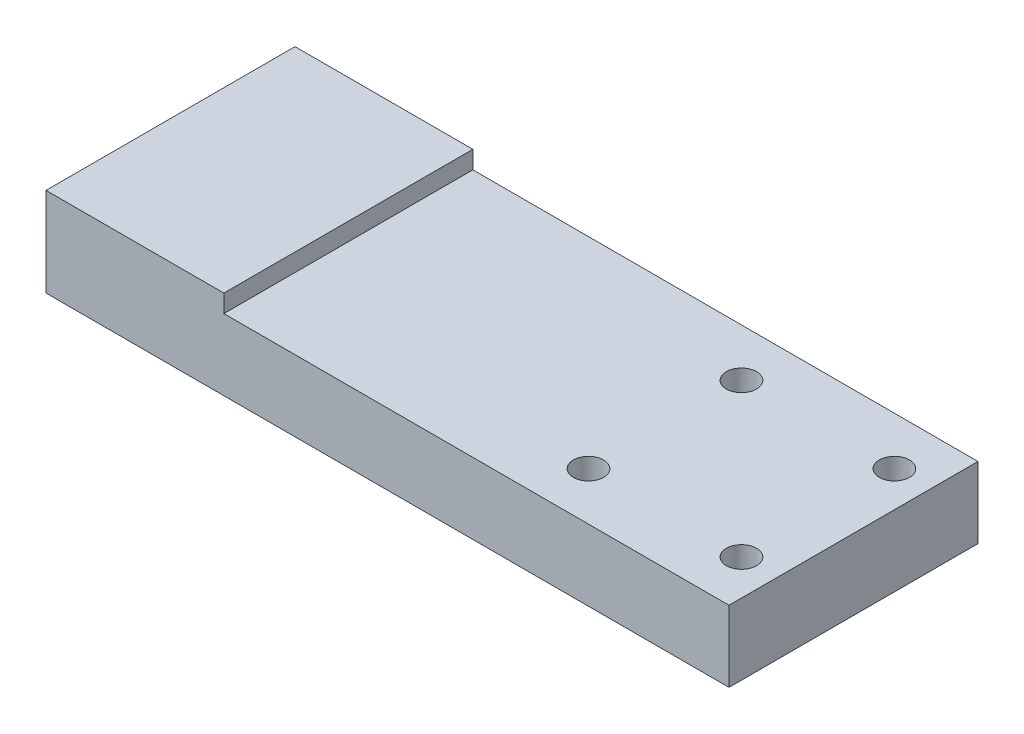
ISO-10303-21;
HEADER;
FILE_DESCRIPTION(('STEP AP214'),'2;1');
FILE_NAME('part.step','',(''),(''),'','','');
FILE_SCHEMA(('AUTOMOTIVE_DESIGN { 1 0 10303 214 1 1 1 1 }'));
ENDSEC;
DATA;
#1=APPLICATION_CONTEXT('core data for automotive mechanical design processes');
#2=APPLICATION_PROTOCOL_DEFINITION('international standard','automotive_design',2000,#1);
#3=PRODUCT_CONTEXT('',#1,'mechanical');
#4=PRODUCT('Part','Part','',(#3));
#5=PRODUCT_RELATED_PRODUCT_CATEGORY('part','',(#4));
#6=PRODUCT_DEFINITION_FORMATION('','',#4);
#7=PRODUCT_DEFINITION_CONTEXT('part definition',#1,'design');
#8=PRODUCT_DEFINITION('design','',#6,#7);
#9=PRODUCT_DEFINITION_SHAPE('','',#8);
#10=(LENGTH_UNIT() NAMED_UNIT(*) SI_UNIT(.MILLI.,.METRE.));
#11=(NAMED_UNIT(*) PLANE_ANGLE_UNIT() SI_UNIT($,.RADIAN.));
#12=(NAMED_UNIT(*) SI_UNIT($,.STERADIAN.) SOLID_ANGLE_UNIT());
#13=UNCERTAINTY_MEASURE_WITH_UNIT(LENGTH_MEASURE(1.E-05),#10,'distance_accuracy_value','');
#14=(GEOMETRIC_REPRESENTATION_CONTEXT(3) GLOBAL_UNCERTAINTY_ASSIGNED_CONTEXT((#13)) GLOBAL_UNIT_ASSIGNED_CONTEXT((#10,
#11,#12)) REPRESENTATION_CONTEXT('',''));
#15=CARTESIAN_POINT('',(0.,0.,0.));
#16=DIRECTION('',(0.,0.,1.));
#17=DIRECTION('',(1.,0.,0.));
#18=AXIS2_PLACEMENT_3D('',#15,#16,#17);
#19=CARTESIAN_POINT('',(43.,25.001,-21.5));
#20=DIRECTION('',(0.,-1.,0.));
#21=DIRECTION('',(0.,0.,-1.));
#22=AXIS2_PLACEMENT_3D('',#19,#20,#21);
#23=CYLINDRICAL_SURFACE('',#22,4.25);
#24=CARTESIAN_POINT('',(43.,0.,-21.5));
#25=DIRECTION('',(0.,-1.,0.));
#26=DIRECTION('',(0.,0.,-1.));
#27=AXIS2_PLACEMENT_3D('',#24,#25,#26);
#28=CIRCLE('',#27,4.25);
#29=CARTESIAN_POINT('',(43.,0.,-25.75));
#30=VERTEX_POINT('',#29);
#31=EDGE_CURVE('E11',#30,#30,#28,.T.);
#32=ORIENTED_EDGE('',*,*,#31,.T.);
#33=EDGE_LOOP('',(#32));
#34=FACE_BOUND('',#33,.T.);
#35=CARTESIAN_POINT('',(43.,20.,-21.5));
#36=DIRECTION('',(0.,1.,0.));
#37=DIRECTION('',(0.,0.,1.));
#38=AXIS2_PLACEMENT_3D('',#35,#36,#37);
#39=CIRCLE('',#38,4.25);
#40=CARTESIAN_POINT('',(43.,20.,-17.25));
#41=VERTEX_POINT('',#40);
#42=EDGE_CURVE('E135',#41,#41,#39,.F.);
#43=ORIENTED_EDGE('',*,*,#42,.F.);
#44=EDGE_LOOP('',(#43));
#45=FACE_BOUND('',#44,.T.);
#46=ADVANCED_FACE('F35',(#34,#45),#23,.F.);
#47=CARTESIAN_POINT('',(86.,25.001,-21.5));
#48=DIRECTION('',(0.,-1.,0.));
#49=DIRECTION('',(0.,0.,-1.));
#50=AXIS2_PLACEMENT_3D('',#47,#48,#49);
#51=CYLINDRICAL_SURFACE('',#50,4.25);
#52=CARTESIAN_POINT('',(86.,0.,-21.5));
#53=DIRECTION('',(0.,-1.,0.));
#54=DIRECTION('',(0.,0.,-1.));
#55=AXIS2_PLACEMENT_3D('',#52,#53,#54);
#56=CIRCLE('',#55,4.25);
#57=CARTESIAN_POINT('',(86.,0.,-25.75));
#58=VERTEX_POINT('',#57);
#59=EDGE_CURVE('E43',#58,#58,#56,.T.);
#60=ORIENTED_EDGE('',*,*,#59,.T.);
#61=EDGE_LOOP('',(#60));
#62=FACE_BOUND('',#61,.T.);
#63=CARTESIAN_POINT('',(86.,20.,-21.5));
#64=DIRECTION('',(0.,1.,0.));
#65=DIRECTION('',(0.,0.,1.));
#66=AXIS2_PLACEMENT_3D('',#63,#64,#65);
#67=CIRCLE('',#66,4.25);
#68=CARTESIAN_POINT('',(86.,20.,-17.25));
#69=VERTEX_POINT('',#68);
#70=EDGE_CURVE('E137',#69,#69,#67,.F.);
#71=ORIENTED_EDGE('',*,*,#70,.F.);
#72=EDGE_LOOP('',(#71));
#73=FACE_BOUND('',#72,.T.);
#74=ADVANCED_FACE('F121',(#62,#73),#51,.F.);
#75=CARTESIAN_POINT('',(96.,25.,35.));
#76=DIRECTION('',(-1.,0.,0.));
#77=DIRECTION('',(0.,0.,1.));
#78=AXIS2_PLACEMENT_3D('',#75,#76,#77);
#79=PLANE('',#78);
#80=DIRECTION('',(0.,0.,-1.));
#81=VECTOR('',#80,1.);
#82=CARTESIAN_POINT('',(96.,20.,35.));
#83=LINE('',#82,#81);
#84=CARTESIAN_POINT('',(96.,20.,35.));
#85=VERTEX_POINT('',#84);
#86=CARTESIAN_POINT('',(96.,20.,-35.));
#87=VERTEX_POINT('',#86);
#88=EDGE_CURVE('E164',#85,#87,#83,.T.);
#89=ORIENTED_EDGE('',*,*,#88,.F.);
#90=DIRECTION('',(0.,-1.,0.));
#91=VECTOR('',#90,1.);
#92=CARTESIAN_POINT('',(96.,25.,35.));
#93=LINE('',#92,#91);
#94=CARTESIAN_POINT('',(96.,0.,35.));
#95=VERTEX_POINT('',#94);
#96=EDGE_CURVE('E114',#85,#95,#93,.T.);
#97=ORIENTED_EDGE('',*,*,#96,.T.);
#98=DIRECTION('',(0.,0.,-1.));
#99=VECTOR('',#98,1.);
#100=CARTESIAN_POINT('',(96.,0.,35.));
#101=LINE('',#100,#99);
#102=CARTESIAN_POINT('',(96.,0.,-35.));
#103=VERTEX_POINT('',#102);
#104=EDGE_CURVE('E90',#95,#103,#101,.T.);
#105=ORIENTED_EDGE('',*,*,#104,.T.);
#106=DIRECTION('',(0.,-1.,0.));
#107=VECTOR('',#106,1.);
#108=CARTESIAN_POINT('',(96.,25.,-35.));
#109=LINE('',#108,#107);
#110=EDGE_CURVE('E84',#87,#103,#109,.T.);
#111=ORIENTED_EDGE('',*,*,#110,.F.);
#112=EDGE_LOOP('',(#89,#97,#105,#111));
#113=FACE_BOUND('',#112,.T.);
#114=ADVANCED_FACE('F176',(#113),#79,.F.);
#115=CARTESIAN_POINT('',(86.,25.001,21.5));
#116=DIRECTION('',(0.,-1.,0.));
#117=DIRECTION('',(0.,0.,-1.));
#118=AXIS2_PLACEMENT_3D('',#115,#116,#117);
#119=CYLINDRICAL_SURFACE('',#118,4.25);
#120=CARTESIAN_POINT('',(86.,0.,21.5));
#121=DIRECTION('',(0.,-1.,0.));
#122=DIRECTION('',(0.,0.,-1.));
#123=AXIS2_PLACEMENT_3D('',#120,#121,#122);
#124=CIRCLE('',#123,4.25);
#125=CARTESIAN_POINT('',(86.,0.,17.25));
#126=VERTEX_POINT('',#125);
#127=EDGE_CURVE('E103',#126,#126,#124,.T.);
#128=ORIENTED_EDGE('',*,*,#127,.T.);
#129=EDGE_LOOP('',(#128));
#130=FACE_BOUND('',#129,.T.);
#131=CARTESIAN_POINT('',(86.,20.,21.5));
#132=DIRECTION('',(0.,1.,0.));
#133=DIRECTION('',(0.,0.,1.));
#134=AXIS2_PLACEMENT_3D('',#131,#132,#133);
#135=CIRCLE('',#134,4.25);
#136=CARTESIAN_POINT('',(86.,20.,25.75));
#137=VERTEX_POINT('',#136);
#138=EDGE_CURVE('E142',#137,#137,#135,.F.);
#139=ORIENTED_EDGE('',*,*,#138,.F.);
#140=EDGE_LOOP('',(#139));
#141=FACE_BOUND('',#140,.T.);
#142=ADVANCED_FACE('F173',(#130,#141),#119,.F.);
#143=CARTESIAN_POINT('',(43.,25.001,21.5));
#144=DIRECTION('',(0.,-1.,0.));
#145=DIRECTION('',(0.,0.,-1.));
#146=AXIS2_PLACEMENT_3D('',#143,#144,#145);
#147=CYLINDRICAL_SURFACE('',#146,4.25);
#148=CARTESIAN_POINT('',(43.,0.,21.5));
#149=DIRECTION('',(0.,-1.,0.));
#150=DIRECTION('',(0.,0.,-1.));
#151=AXIS2_PLACEMENT_3D('',#148,#149,#150);
#152=CIRCLE('',#151,4.25);
#153=CARTESIAN_POINT('',(43.,0.,17.25));
#154=VERTEX_POINT('',#153);
#155=EDGE_CURVE('E107',#154,#154,#152,.T.);
#156=ORIENTED_EDGE('',*,*,#155,.T.);
#157=EDGE_LOOP('',(#156));
#158=FACE_BOUND('',#157,.T.);
#159=CARTESIAN_POINT('',(43.,20.,21.5));
#160=DIRECTION('',(0.,1.,0.));
#161=DIRECTION('',(0.,0.,1.));
#162=AXIS2_PLACEMENT_3D('',#159,#160,#161);
#163=CIRCLE('',#162,4.25);
#164=CARTESIAN_POINT('',(43.,20.,25.75));
#165=VERTEX_POINT('',#164);
#166=EDGE_CURVE('E38',#165,#165,#163,.F.);
#167=ORIENTED_EDGE('',*,*,#166,.F.);
#168=EDGE_LOOP('',(#167));
#169=FACE_BOUND('',#168,.T.);
#170=ADVANCED_FACE('F175',(#158,#169),#147,.F.);
#171=CARTESIAN_POINT('',(-96.,25.,35.));
#172=DIRECTION('',(1.,0.,0.));
#173=DIRECTION('',(0.,0.,-1.));
#174=AXIS2_PLACEMENT_3D('',#171,#172,#173);
#175=PLANE('',#174);
#176=DIRECTION('',(0.,0.,1.));
#177=VECTOR('',#176,1.);
#178=CARTESIAN_POINT('',(-96.,0.,35.));
#179=LINE('',#178,#177);
#180=CARTESIAN_POINT('',(-96.,0.,-35.));
#181=VERTEX_POINT('',#180);
#182=CARTESIAN_POINT('',(-96.,0.,35.));
#183=VERTEX_POINT('',#182);
#184=EDGE_CURVE('E96',#181,#183,#179,.T.);
#185=ORIENTED_EDGE('',*,*,#184,.T.);
#186=DIRECTION('',(0.,-1.,0.));
#187=VECTOR('',#186,1.);
#188=CARTESIAN_POINT('',(-96.,25.,35.));
#189=LINE('',#188,#187);
#190=CARTESIAN_POINT('',(-96.,25.,35.));
#191=VERTEX_POINT('',#190);
#192=EDGE_CURVE('E116',#191,#183,#189,.T.);
#193=ORIENTED_EDGE('',*,*,#192,.F.);
#194=DIRECTION('',(0.,0.,1.));
#195=VECTOR('',#194,1.);
#196=CARTESIAN_POINT('',(-96.,25.,35.));
#197=LINE('',#196,#195);
#198=CARTESIAN_POINT('',(-96.,25.,-35.));
#199=VERTEX_POINT('',#198);
#200=EDGE_CURVE('E89',#199,#191,#197,.T.);
#201=ORIENTED_EDGE('',*,*,#200,.F.);
#202=DIRECTION('',(0.,-1.,0.));
#203=VECTOR('',#202,1.);
#204=CARTESIAN_POINT('',(-96.,25.,-35.));
#205=LINE('',#204,#203);
#206=EDGE_CURVE('E80',#199,#181,#205,.T.);
#207=ORIENTED_EDGE('',*,*,#206,.T.);
#208=EDGE_LOOP('',(#185,#193,#201,#207));
#209=FACE_BOUND('',#208,.T.);
#210=ADVANCED_FACE('F94',(#209),#175,.F.);
#211=CARTESIAN_POINT('',(96.,25.,35.));
#212=DIRECTION('',(0.,0.,-1.));
#213=DIRECTION('',(-1.,0.,0.));
#214=AXIS2_PLACEMENT_3D('',#211,#212,#213);
#215=PLANE('',#214);
#216=DIRECTION('',(1.,0.,0.));
#217=VECTOR('',#216,1.);
#218=CARTESIAN_POINT('',(-46.,20.,35.));
#219=LINE('',#218,#217);
#220=CARTESIAN_POINT('',(-46.,20.,35.));
#221=VERTEX_POINT('',#220);
#222=EDGE_CURVE('E160',#221,#85,#219,.T.);
#223=ORIENTED_EDGE('',*,*,#222,.F.);
#224=DIRECTION('',(0.,1.,0.));
#225=VECTOR('',#224,1.);
#226=CARTESIAN_POINT('',(-46.,20.,35.));
#227=LINE('',#226,#225);
#228=CARTESIAN_POINT('',(-46.,25.,35.));
#229=VERTEX_POINT('',#228);
#230=EDGE_CURVE('E156',#221,#229,#227,.T.);
#231=ORIENTED_EDGE('',*,*,#230,.T.);
#232=DIRECTION('',(1.,0.,0.));
#233=VECTOR('',#232,1.);
#234=CARTESIAN_POINT('',(96.,25.,35.));
#235=LINE('',#234,#233);
#236=EDGE_CURVE('E146',#191,#229,#235,.T.);
#237=ORIENTED_EDGE('',*,*,#236,.F.);
#238=ORIENTED_EDGE('',*,*,#192,.T.);
#239=DIRECTION('',(1.,0.,0.));
#240=VECTOR('',#239,1.);
#241=CARTESIAN_POINT('',(96.,0.,35.));
#242=LINE('',#241,#240);
#243=EDGE_CURVE('E101',#183,#95,#242,.T.);
#244=ORIENTED_EDGE('',*,*,#243,.T.);
#245=ORIENTED_EDGE('',*,*,#96,.F.);
#246=EDGE_LOOP('',(#223,#231,#237,#238,#244,#245));
#247=FACE_BOUND('',#246,.T.);
#248=ADVANCED_FACE('F154',(#247),#215,.F.);
#249=CARTESIAN_POINT('',(96.,25.,-35.));
#250=DIRECTION('',(0.,0.,1.));
#251=DIRECTION('',(1.,0.,0.));
#252=AXIS2_PLACEMENT_3D('',#249,#250,#251);
#253=PLANE('',#252);
#254=DIRECTION('',(-1.,0.,0.));
#255=VECTOR('',#254,1.);
#256=CARTESIAN_POINT('',(96.,25.,-35.));
#257=LINE('',#256,#255);
#258=CARTESIAN_POINT('',(-46.,25.,-35.));
#259=VERTEX_POINT('',#258);
#260=EDGE_CURVE('E58',#259,#199,#257,.T.);
#261=ORIENTED_EDGE('',*,*,#260,.F.);
#262=DIRECTION('',(0.,1.,0.));
#263=VECTOR('',#262,1.);
#264=CARTESIAN_POINT('',(-46.,20.,-35.));
#265=LINE('',#264,#263);
#266=CARTESIAN_POINT('',(-46.,20.,-35.));
#267=VERTEX_POINT('',#266);
#268=EDGE_CURVE('E50',#267,#259,#265,.T.);
#269=ORIENTED_EDGE('',*,*,#268,.F.);
#270=DIRECTION('',(-1.,0.,0.));
#271=VECTOR('',#270,1.);
#272=CARTESIAN_POINT('',(96.,20.,-35.));
#273=LINE('',#272,#271);
#274=EDGE_CURVE('E257',#87,#267,#273,.T.);
#275=ORIENTED_EDGE('',*,*,#274,.F.);
#276=ORIENTED_EDGE('',*,*,#110,.T.);
#277=DIRECTION('',(-1.,0.,0.));
#278=VECTOR('',#277,1.);
#279=CARTESIAN_POINT('',(96.,0.,-35.));
#280=LINE('',#279,#278);
#281=EDGE_CURVE('E77',#103,#181,#280,.T.);
#282=ORIENTED_EDGE('',*,*,#281,.T.);
#283=ORIENTED_EDGE('',*,*,#206,.F.);
#284=EDGE_LOOP('',(#261,#269,#275,#276,#282,#283));
#285=FACE_BOUND('',#284,.T.);
#286=ADVANCED_FACE('F79',(#285),#253,.F.);
#287=CARTESIAN_POINT('',(0.,25.,0.));
#288=DIRECTION('',(0.,1.,0.));
#289=DIRECTION('',(0.,0.,1.));
#290=AXIS2_PLACEMENT_3D('',#287,#288,#289);
#291=PLANE('',#290);
#292=DIRECTION('',(0.,0.,1.));
#293=VECTOR('',#292,1.);
#294=CARTESIAN_POINT('',(-46.,25.,-35.));
#295=LINE('',#294,#293);
#296=EDGE_CURVE('E149',#259,#229,#295,.T.);
#297=ORIENTED_EDGE('',*,*,#296,.F.);
#298=ORIENTED_EDGE('',*,*,#260,.T.);
#299=ORIENTED_EDGE('',*,*,#200,.T.);
#300=ORIENTED_EDGE('',*,*,#236,.T.);
#301=EDGE_LOOP('',(#297,#298,#299,#300));
#302=FACE_BOUND('',#301,.T.);
#303=ADVANCED_FACE('F126',(#302),#291,.T.);
#304=CARTESIAN_POINT('',(0.,0.,0.));
#305=DIRECTION('',(0.,1.,0.));
#306=DIRECTION('',(0.,0.,1.));
#307=AXIS2_PLACEMENT_3D('',#304,#305,#306);
#308=PLANE('',#307);
#309=ORIENTED_EDGE('',*,*,#155,.F.);
#310=EDGE_LOOP('',(#309));
#311=FACE_BOUND('',#310,.T.);
#312=ORIENTED_EDGE('',*,*,#127,.F.);
#313=EDGE_LOOP('',(#312));
#314=FACE_BOUND('',#313,.T.);
#315=ORIENTED_EDGE('',*,*,#184,.F.);
#316=ORIENTED_EDGE('',*,*,#281,.F.);
#317=ORIENTED_EDGE('',*,*,#104,.F.);
#318=ORIENTED_EDGE('',*,*,#243,.F.);
#319=EDGE_LOOP('',(#315,#316,#317,#318));
#320=FACE_BOUND('',#319,.T.);
#321=ORIENTED_EDGE('',*,*,#59,.F.);
#322=EDGE_LOOP('',(#321));
#323=FACE_BOUND('',#322,.T.);
#324=ORIENTED_EDGE('',*,*,#31,.F.);
#325=EDGE_LOOP('',(#324));
#326=FACE_BOUND('',#325,.T.);
#327=ADVANCED_FACE('F98',(#311,#314,#320,#323,#326),#308,.F.);
#328=CARTESIAN_POINT('',(0.,20.,0.));
#329=DIRECTION('',(0.,1.,0.));
#330=DIRECTION('',(0.,0.,1.));
#331=AXIS2_PLACEMENT_3D('',#328,#329,#330);
#332=PLANE('',#331);
#333=ORIENTED_EDGE('',*,*,#274,.T.);
#334=DIRECTION('',(0.,0.,1.));
#335=VECTOR('',#334,1.);
#336=CARTESIAN_POINT('',(-46.,20.,-35.));
#337=LINE('',#336,#335);
#338=EDGE_CURVE('E259',#267,#221,#337,.T.);
#339=ORIENTED_EDGE('',*,*,#338,.T.);
#340=ORIENTED_EDGE('',*,*,#222,.T.);
#341=ORIENTED_EDGE('',*,*,#88,.T.);
#342=EDGE_LOOP('',(#333,#339,#340,#341));
#343=FACE_BOUND('',#342,.T.);
#344=ORIENTED_EDGE('',*,*,#166,.T.);
#345=EDGE_LOOP('',(#344));
#346=FACE_BOUND('',#345,.T.);
#347=ORIENTED_EDGE('',*,*,#138,.T.);
#348=EDGE_LOOP('',(#347));
#349=FACE_BOUND('',#348,.T.);
#350=ORIENTED_EDGE('',*,*,#70,.T.);
#351=EDGE_LOOP('',(#350));
#352=FACE_BOUND('',#351,.T.);
#353=ORIENTED_EDGE('',*,*,#42,.T.);
#354=EDGE_LOOP('',(#353));
#355=FACE_BOUND('',#354,.T.);
#356=ADVANCED_FACE('F125',(#343,#346,#349,#352,#355),#332,.T.);
#357=CARTESIAN_POINT('',(-46.,20.,-35.));
#358=DIRECTION('',(-1.,0.,0.));
#359=DIRECTION('',(0.,0.,1.));
#360=AXIS2_PLACEMENT_3D('',#357,#358,#359);
#361=PLANE('',#360);
#362=ORIENTED_EDGE('',*,*,#296,.T.);
#363=ORIENTED_EDGE('',*,*,#230,.F.);
#364=ORIENTED_EDGE('',*,*,#338,.F.);
#365=ORIENTED_EDGE('',*,*,#268,.T.);
#366=EDGE_LOOP('',(#362,#363,#364,#365));
#367=FACE_BOUND('',#366,.T.);
#368=ADVANCED_FACE('F244',(#367),#361,.F.);
#369=CLOSED_SHELL('',(#46,#74,#114,#142,#170,#210,#248,#286,#303,#327,#356,#368));
#370=MANIFOLD_SOLID_BREP('B2',#369);
#371=ADVANCED_BREP_SHAPE_REPRESENTATION('',(#18,#370),#14);
#372=SHAPE_DEFINITION_REPRESENTATION(#9,#371);
ENDSEC;
END-ISO-10303-21;
